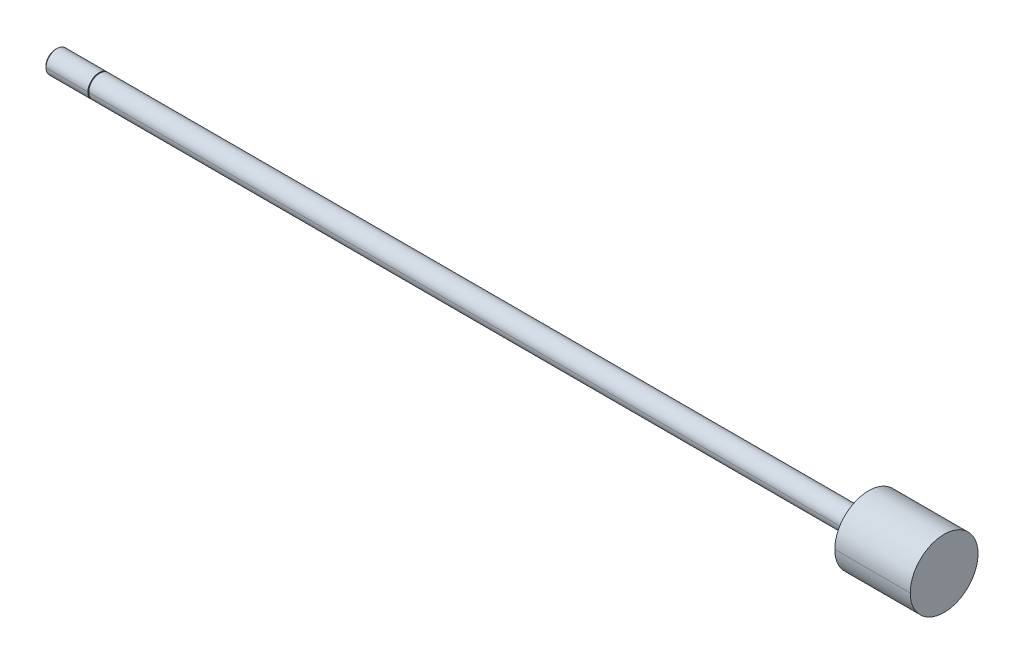
ISO-10303-21;
HEADER;
FILE_DESCRIPTION(('STEP AP214'),'2;1');
FILE_NAME('part.step','',(''),(''),'','','');
FILE_SCHEMA(('AUTOMOTIVE_DESIGN { 1 0 10303 214 1 1 1 1 }'));
ENDSEC;
DATA;
#1=APPLICATION_CONTEXT('core data for automotive mechanical design processes');
#2=APPLICATION_PROTOCOL_DEFINITION('international standard','automotive_design',2000,#1);
#3=PRODUCT_CONTEXT('',#1,'mechanical');
#4=PRODUCT('Part','Part','',(#3));
#5=PRODUCT_RELATED_PRODUCT_CATEGORY('part','',(#4));
#6=PRODUCT_DEFINITION_FORMATION('','',#4);
#7=PRODUCT_DEFINITION_CONTEXT('part definition',#1,'design');
#8=PRODUCT_DEFINITION('design','',#6,#7);
#9=PRODUCT_DEFINITION_SHAPE('','',#8);
#10=(LENGTH_UNIT() NAMED_UNIT(*) SI_UNIT(.MILLI.,.METRE.));
#11=(NAMED_UNIT(*) PLANE_ANGLE_UNIT() SI_UNIT($,.RADIAN.));
#12=(NAMED_UNIT(*) SI_UNIT($,.STERADIAN.) SOLID_ANGLE_UNIT());
#13=UNCERTAINTY_MEASURE_WITH_UNIT(LENGTH_MEASURE(1.E-05),#10,'distance_accuracy_value','');
#14=(GEOMETRIC_REPRESENTATION_CONTEXT(3) GLOBAL_UNCERTAINTY_ASSIGNED_CONTEXT((#13)) GLOBAL_UNIT_ASSIGNED_CONTEXT((#10,
#11,#12)) REPRESENTATION_CONTEXT('',''));
#15=CARTESIAN_POINT('',(0.,0.,0.));
#16=DIRECTION('',(0.,0.,1.));
#17=DIRECTION('',(1.,0.,0.));
#18=AXIS2_PLACEMENT_3D('',#15,#16,#17);
#19=CARTESIAN_POINT('',(0.,0.,0.));
#20=DIRECTION('',(-1.,0.,0.));
#21=DIRECTION('',(0.,-1.,0.));
#22=AXIS2_PLACEMENT_3D('',#19,#20,#21);
#23=CYLINDRICAL_SURFACE('',#22,2.921);
#24=CARTESIAN_POINT('',(0.,0.,0.));
#25=DIRECTION('',(1.,0.,0.));
#26=DIRECTION('',(0.,0.,-1.));
#27=AXIS2_PLACEMENT_3D('',#24,#25,#26);
#28=CIRCLE('',#27,2.921);
#29=CARTESIAN_POINT('',(0.,0.,-2.921));
#30=VERTEX_POINT('',#29);
#31=CARTESIAN_POINT('',(0.,0.,2.921));
#32=VERTEX_POINT('',#31);
#33=EDGE_CURVE('E11',#30,#32,#28,.T.);
#34=ORIENTED_EDGE('',*,*,#33,.F.);
#35=DIRECTION('',(-1.,0.,0.));
#36=VECTOR('',#35,1.);
#37=CARTESIAN_POINT('',(0.,0.,-2.921));
#38=LINE('',#37,#36);
#39=CARTESIAN_POINT('',(-0.254,0.,-2.921));
#40=VERTEX_POINT('',#39);
#41=EDGE_CURVE('E25',#30,#40,#38,.T.);
#42=ORIENTED_EDGE('',*,*,#41,.T.);
#43=CARTESIAN_POINT('',(-0.254,0.,0.));
#44=DIRECTION('',(1.,0.,0.));
#45=DIRECTION('',(0.,0.,-1.));
#46=AXIS2_PLACEMENT_3D('',#43,#44,#45);
#47=CIRCLE('',#46,2.921);
#48=CARTESIAN_POINT('',(-0.254,0.,2.921));
#49=VERTEX_POINT('',#48);
#50=EDGE_CURVE('E211',#40,#49,#47,.T.);
#51=ORIENTED_EDGE('',*,*,#50,.T.);
#52=DIRECTION('',(-1.,0.,0.));
#53=VECTOR('',#52,1.);
#54=CARTESIAN_POINT('',(0.,0.,2.921));
#55=LINE('',#54,#53);
#56=EDGE_CURVE('E206',#32,#49,#55,.T.);
#57=ORIENTED_EDGE('',*,*,#56,.F.);
#58=EDGE_LOOP('',(#34,#42,#51,#57));
#59=FACE_BOUND('',#58,.T.);
#60=ADVANCED_FACE('F17',(#59),#23,.T.);
#61=CARTESIAN_POINT('',(0.,0.,0.));
#62=DIRECTION('',(-1.,0.,0.));
#63=DIRECTION('',(0.,1.,0.));
#64=AXIS2_PLACEMENT_3D('',#61,#62,#63);
#65=CYLINDRICAL_SURFACE('',#64,2.921);
#66=CARTESIAN_POINT('',(-0.254,0.,0.));
#67=DIRECTION('',(1.,0.,0.));
#68=DIRECTION('',(0.,0.,-1.));
#69=AXIS2_PLACEMENT_3D('',#66,#67,#68);
#70=CIRCLE('',#69,2.921);
#71=EDGE_CURVE('E202',#49,#40,#70,.T.);
#72=ORIENTED_EDGE('',*,*,#71,.T.);
#73=ORIENTED_EDGE('',*,*,#41,.F.);
#74=CARTESIAN_POINT('',(0.,0.,0.));
#75=DIRECTION('',(1.,0.,0.));
#76=DIRECTION('',(0.,0.,-1.));
#77=AXIS2_PLACEMENT_3D('',#74,#75,#76);
#78=CIRCLE('',#77,2.921);
#79=EDGE_CURVE('E197',#32,#30,#78,.T.);
#80=ORIENTED_EDGE('',*,*,#79,.F.);
#81=ORIENTED_EDGE('',*,*,#56,.T.);
#82=EDGE_LOOP('',(#72,#73,#80,#81));
#83=FACE_BOUND('',#82,.T.);
#84=ADVANCED_FACE('F224',(#83),#65,.T.);
#85=CARTESIAN_POINT('',(0.,2.921,0.));
#86=DIRECTION('',(1.,0.,0.));
#87=DIRECTION('',(0.,0.,-1.));
#88=AXIS2_PLACEMENT_3D('',#85,#86,#87);
#89=PLANE('',#88);
#90=CARTESIAN_POINT('',(0.,0.,0.));
#91=DIRECTION('',(1.,0.,0.));
#92=DIRECTION('',(0.,0.,-1.));
#93=AXIS2_PLACEMENT_3D('',#90,#91,#92);
#94=CIRCLE('',#93,3.175);
#95=CARTESIAN_POINT('',(0.,0.,-3.175));
#96=VERTEX_POINT('',#95);
#97=CARTESIAN_POINT('',(0.,0.,3.175));
#98=VERTEX_POINT('',#97);
#99=EDGE_CURVE('E192',#96,#98,#94,.T.);
#100=ORIENTED_EDGE('',*,*,#99,.F.);
#101=CARTESIAN_POINT('',(0.,0.,0.));
#102=DIRECTION('',(1.,0.,0.));
#103=DIRECTION('',(0.,0.,-1.));
#104=AXIS2_PLACEMENT_3D('',#101,#102,#103);
#105=CIRCLE('',#104,3.175);
#106=EDGE_CURVE('E187',#98,#96,#105,.T.);
#107=ORIENTED_EDGE('',*,*,#106,.F.);
#108=EDGE_LOOP('',(#100,#107));
#109=FACE_BOUND('',#108,.T.);
#110=ORIENTED_EDGE('',*,*,#33,.T.);
#111=ORIENTED_EDGE('',*,*,#79,.T.);
#112=EDGE_LOOP('',(#110,#111));
#113=FACE_BOUND('',#112,.T.);
#114=ADVANCED_FACE('F249',(#109,#113),#89,.F.);
#115=CARTESIAN_POINT('',(239.7252,0.,0.));
#116=DIRECTION('',(-1.,0.,0.));
#117=DIRECTION('',(0.,1.,0.));
#118=AXIS2_PLACEMENT_3D('',#115,#116,#117);
#119=CYLINDRICAL_SURFACE('',#118,3.175);
#120=ORIENTED_EDGE('',*,*,#106,.T.);
#121=DIRECTION('',(-1.,0.,0.));
#122=VECTOR('',#121,1.);
#123=CARTESIAN_POINT('',(218.2876,0.,-3.175));
#124=LINE('',#123,#122);
#125=CARTESIAN_POINT('',(218.2876,0.,-3.175));
#126=VERTEX_POINT('',#125);
#127=EDGE_CURVE('E182',#126,#96,#124,.T.);
#128=ORIENTED_EDGE('',*,*,#127,.F.);
#129=CARTESIAN_POINT('',(218.2876,0.,0.));
#130=DIRECTION('',(1.,0.,0.));
#131=DIRECTION('',(0.,0.,-1.));
#132=AXIS2_PLACEMENT_3D('',#129,#130,#131);
#133=CIRCLE('',#132,3.175);
#134=CARTESIAN_POINT('',(218.2876,0.,3.175));
#135=VERTEX_POINT('',#134);
#136=EDGE_CURVE('E177',#135,#126,#133,.T.);
#137=ORIENTED_EDGE('',*,*,#136,.F.);
#138=DIRECTION('',(-1.,0.,0.));
#139=VECTOR('',#138,1.);
#140=CARTESIAN_POINT('',(218.2876,0.,3.175));
#141=LINE('',#140,#139);
#142=EDGE_CURVE('E172',#135,#98,#141,.T.);
#143=ORIENTED_EDGE('',*,*,#142,.T.);
#144=EDGE_LOOP('',(#120,#128,#137,#143));
#145=FACE_BOUND('',#144,.T.);
#146=ADVANCED_FACE('F253',(#145),#119,.T.);
#147=CARTESIAN_POINT('',(239.7252,0.,0.));
#148=DIRECTION('',(-1.,0.,0.));
#149=DIRECTION('',(0.,-1.,0.));
#150=AXIS2_PLACEMENT_3D('',#147,#148,#149);
#151=CYLINDRICAL_SURFACE('',#150,3.175);
#152=CARTESIAN_POINT('',(218.2876,0.,0.));
#153=DIRECTION('',(1.,0.,0.));
#154=DIRECTION('',(0.,0.,-1.));
#155=AXIS2_PLACEMENT_3D('',#152,#153,#154);
#156=CIRCLE('',#155,3.175);
#157=EDGE_CURVE('E167',#126,#135,#156,.T.);
#158=ORIENTED_EDGE('',*,*,#157,.F.);
#159=ORIENTED_EDGE('',*,*,#127,.T.);
#160=ORIENTED_EDGE('',*,*,#99,.T.);
#161=ORIENTED_EDGE('',*,*,#142,.F.);
#162=EDGE_LOOP('',(#158,#159,#160,#161));
#163=FACE_BOUND('',#162,.T.);
#164=ADVANCED_FACE('F259',(#163),#151,.T.);
#165=CARTESIAN_POINT('',(218.2876,3.175,0.));
#166=DIRECTION('',(1.,0.,0.));
#167=DIRECTION('',(0.,0.,-1.));
#168=AXIS2_PLACEMENT_3D('',#165,#166,#167);
#169=PLANE('',#168);
#170=CARTESIAN_POINT('',(218.2876,0.,0.));
#171=DIRECTION('',(1.,0.,0.));
#172=DIRECTION('',(0.,0.,-1.));
#173=AXIS2_PLACEMENT_3D('',#170,#171,#172);
#174=CIRCLE('',#173,9.62025);
#175=CARTESIAN_POINT('',(218.2876,0.,-9.62025));
#176=VERTEX_POINT('',#175);
#177=CARTESIAN_POINT('',(218.2876,0.,9.62025));
#178=VERTEX_POINT('',#177);
#179=EDGE_CURVE('E162',#176,#178,#174,.T.);
#180=ORIENTED_EDGE('',*,*,#179,.F.);
#181=CARTESIAN_POINT('',(218.2876,0.,0.));
#182=DIRECTION('',(1.,0.,0.));
#183=DIRECTION('',(0.,0.,-1.));
#184=AXIS2_PLACEMENT_3D('',#181,#182,#183);
#185=CIRCLE('',#184,9.62025);
#186=EDGE_CURVE('E157',#178,#176,#185,.T.);
#187=ORIENTED_EDGE('',*,*,#186,.F.);
#188=EDGE_LOOP('',(#180,#187));
#189=FACE_BOUND('',#188,.T.);
#190=ORIENTED_EDGE('',*,*,#157,.T.);
#191=ORIENTED_EDGE('',*,*,#136,.T.);
#192=EDGE_LOOP('',(#190,#191));
#193=FACE_BOUND('',#192,.T.);
#194=ADVANCED_FACE('F263',(#189,#193),#169,.F.);
#195=CARTESIAN_POINT('',(239.7252,0.,0.));
#196=DIRECTION('',(-1.,0.,0.));
#197=DIRECTION('',(0.,1.,0.));
#198=AXIS2_PLACEMENT_3D('',#195,#196,#197);
#199=CYLINDRICAL_SURFACE('',#198,9.62025);
#200=ORIENTED_EDGE('',*,*,#186,.T.);
#201=DIRECTION('',(-1.,0.,0.));
#202=VECTOR('',#201,1.);
#203=CARTESIAN_POINT('',(239.7252,0.,-9.62025));
#204=LINE('',#203,#202);
#205=CARTESIAN_POINT('',(239.7252,0.,-9.62025));
#206=VERTEX_POINT('',#205);
#207=EDGE_CURVE('E152',#206,#176,#204,.T.);
#208=ORIENTED_EDGE('',*,*,#207,.F.);
#209=CARTESIAN_POINT('',(239.7252,0.,0.));
#210=DIRECTION('',(1.,0.,0.));
#211=DIRECTION('',(0.,0.,-1.));
#212=AXIS2_PLACEMENT_3D('',#209,#210,#211);
#213=CIRCLE('',#212,9.62025);
#214=CARTESIAN_POINT('',(239.7252,0.,9.62025));
#215=VERTEX_POINT('',#214);
#216=EDGE_CURVE('E147',#215,#206,#213,.T.);
#217=ORIENTED_EDGE('',*,*,#216,.F.);
#218=DIRECTION('',(-1.,0.,0.));
#219=VECTOR('',#218,1.);
#220=CARTESIAN_POINT('',(239.7252,0.,9.62025));
#221=LINE('',#220,#219);
#222=EDGE_CURVE('E142',#215,#178,#221,.T.);
#223=ORIENTED_EDGE('',*,*,#222,.T.);
#224=EDGE_LOOP('',(#200,#208,#217,#223));
#225=FACE_BOUND('',#224,.T.);
#226=ADVANCED_FACE('F267',(#225),#199,.T.);
#227=CARTESIAN_POINT('',(239.7252,0.,0.));
#228=DIRECTION('',(-1.,0.,0.));
#229=DIRECTION('',(0.,-1.,0.));
#230=AXIS2_PLACEMENT_3D('',#227,#228,#229);
#231=CYLINDRICAL_SURFACE('',#230,9.62025);
#232=CARTESIAN_POINT('',(239.7252,0.,0.));
#233=DIRECTION('',(1.,0.,0.));
#234=DIRECTION('',(0.,0.,-1.));
#235=AXIS2_PLACEMENT_3D('',#232,#233,#234);
#236=CIRCLE('',#235,9.62025);
#237=EDGE_CURVE('E137',#206,#215,#236,.T.);
#238=ORIENTED_EDGE('',*,*,#237,.F.);
#239=ORIENTED_EDGE('',*,*,#207,.T.);
#240=ORIENTED_EDGE('',*,*,#179,.T.);
#241=ORIENTED_EDGE('',*,*,#222,.F.);
#242=EDGE_LOOP('',(#238,#239,#240,#241));
#243=FACE_BOUND('',#242,.T.);
#244=ADVANCED_FACE('F271',(#243),#231,.T.);
#245=CARTESIAN_POINT('',(239.7252,9.62025,0.));
#246=DIRECTION('',(-1.,0.,0.));
#247=DIRECTION('',(0.,0.,1.));
#248=AXIS2_PLACEMENT_3D('',#245,#246,#247);
#249=PLANE('',#248);
#250=ORIENTED_EDGE('',*,*,#237,.T.);
#251=ORIENTED_EDGE('',*,*,#216,.T.);
#252=EDGE_LOOP('',(#250,#251));
#253=FACE_BOUND('',#252,.T.);
#254=ADVANCED_FACE('F229',(#253),#249,.F.);
#255=CARTESIAN_POINT('',(-0.254,3.429,0.));
#256=DIRECTION('',(-1.,0.,0.));
#257=DIRECTION('',(0.,0.,1.));
#258=AXIS2_PLACEMENT_3D('',#255,#256,#257);
#259=PLANE('',#258);
#260=ORIENTED_EDGE('',*,*,#50,.F.);
#261=ORIENTED_EDGE('',*,*,#71,.F.);
#262=EDGE_LOOP('',(#260,#261));
#263=FACE_BOUND('',#262,.T.);
#264=CARTESIAN_POINT('',(-0.254000000000005,0.,0.));
#265=DIRECTION('',(-1.,0.,0.));
#266=DIRECTION('',(0.,0.,1.));
#267=AXIS2_PLACEMENT_3D('',#264,#265,#266);
#268=CIRCLE('',#267,3.175);
#269=CARTESIAN_POINT('',(-0.254000000000005,0.,3.175));
#270=VERTEX_POINT('',#269);
#271=CARTESIAN_POINT('',(-0.254000000000019,0.,-3.175));
#272=VERTEX_POINT('',#271);
#273=EDGE_CURVE('E132',#270,#272,#268,.T.);
#274=ORIENTED_EDGE('',*,*,#273,.F.);
#275=CARTESIAN_POINT('',(-0.254000000000005,0.,0.));
#276=DIRECTION('',(-1.,0.,0.));
#277=DIRECTION('',(0.,0.,1.));
#278=AXIS2_PLACEMENT_3D('',#275,#276,#277);
#279=CIRCLE('',#278,3.175);
#280=EDGE_CURVE('E127',#272,#270,#279,.T.);
#281=ORIENTED_EDGE('',*,*,#280,.F.);
#282=EDGE_LOOP('',(#274,#281));
#283=FACE_BOUND('',#282,.T.);
#284=ADVANCED_FACE('F225',(#263,#283),#259,.F.);
#285=CARTESIAN_POINT('',(239.7252,0.,0.));
#286=DIRECTION('',(-1.,0.,0.));
#287=DIRECTION('',(0.,1.,0.));
#288=AXIS2_PLACEMENT_3D('',#285,#286,#287);
#289=CYLINDRICAL_SURFACE('',#288,3.175);
#290=CARTESIAN_POINT('',(-12.15898,0.,0.));
#291=DIRECTION('',(1.,0.,0.));
#292=DIRECTION('',(0.,0.,-1.));
#293=AXIS2_PLACEMENT_3D('',#290,#291,#292);
#294=CIRCLE('',#293,3.175);
#295=CARTESIAN_POINT('',(-12.15898,0.,3.175));
#296=VERTEX_POINT('',#295);
#297=CARTESIAN_POINT('',(-12.15898,0.,-3.175));
#298=VERTEX_POINT('',#297);
#299=EDGE_CURVE('E98',#296,#298,#294,.T.);
#300=ORIENTED_EDGE('',*,*,#299,.T.);
#301=DIRECTION('',(-1.,0.,0.));
#302=VECTOR('',#301,1.);
#303=CARTESIAN_POINT('',(-0.254000000000019,0.,-3.175));
#304=LINE('',#303,#302);
#305=EDGE_CURVE('E119',#272,#298,#304,.T.);
#306=ORIENTED_EDGE('',*,*,#305,.F.);
#307=ORIENTED_EDGE('',*,*,#280,.T.);
#308=DIRECTION('',(-1.,0.,0.));
#309=VECTOR('',#308,1.);
#310=CARTESIAN_POINT('',(-0.254000000000019,0.,3.175));
#311=LINE('',#310,#309);
#312=EDGE_CURVE('E115',#270,#296,#311,.T.);
#313=ORIENTED_EDGE('',*,*,#312,.T.);
#314=EDGE_LOOP('',(#300,#306,#307,#313));
#315=FACE_BOUND('',#314,.T.);
#316=ADVANCED_FACE('F228',(#315),#289,.T.);
#317=CARTESIAN_POINT('',(239.7252,0.,0.));
#318=DIRECTION('',(-1.,0.,0.));
#319=DIRECTION('',(0.,-1.,0.));
#320=AXIS2_PLACEMENT_3D('',#317,#318,#319);
#321=CYLINDRICAL_SURFACE('',#320,3.175);
#322=ORIENTED_EDGE('',*,*,#273,.T.);
#323=ORIENTED_EDGE('',*,*,#305,.T.);
#324=CARTESIAN_POINT('',(-12.15898,0.,0.));
#325=DIRECTION('',(1.,0.,0.));
#326=DIRECTION('',(0.,0.,-1.));
#327=AXIS2_PLACEMENT_3D('',#324,#325,#326);
#328=CIRCLE('',#327,3.175);
#329=EDGE_CURVE('E110',#298,#296,#328,.T.);
#330=ORIENTED_EDGE('',*,*,#329,.T.);
#331=ORIENTED_EDGE('',*,*,#312,.F.);
#332=EDGE_LOOP('',(#322,#323,#330,#331));
#333=FACE_BOUND('',#332,.T.);
#334=ADVANCED_FACE('F235',(#333),#321,.T.);
#335=CARTESIAN_POINT('',(-12.7,0.,0.));
#336=DIRECTION('',(1.,0.,0.));
#337=DIRECTION('',(0.,-1.,0.));
#338=AXIS2_PLACEMENT_3D('',#335,#336,#337);
#339=CONICAL_SURFACE('',#338,2.63398,0.7853981634);
#340=ORIENTED_EDGE('',*,*,#329,.F.);
#341=DIRECTION('',(0.707106781184742,0.,-0.707106781188353));
#342=VECTOR('',#341,1.);
#343=CARTESIAN_POINT('',(-12.7,0.,-2.63398));
#344=LINE('',#343,#342);
#345=CARTESIAN_POINT('',(-12.7,0.,-2.63398));
#346=VERTEX_POINT('',#345);
#347=EDGE_CURVE('E90',#346,#298,#344,.T.);
#348=ORIENTED_EDGE('',*,*,#347,.F.);
#349=CARTESIAN_POINT('',(-12.7,0.,0.));
#350=DIRECTION('',(1.,0.,0.));
#351=DIRECTION('',(0.,0.,-1.));
#352=AXIS2_PLACEMENT_3D('',#349,#350,#351);
#353=CIRCLE('',#352,2.63398);
#354=CARTESIAN_POINT('',(-12.7,0.,2.63398));
#355=VERTEX_POINT('',#354);
#356=EDGE_CURVE('E83',#346,#355,#353,.T.);
#357=ORIENTED_EDGE('',*,*,#356,.T.);
#358=DIRECTION('',(0.707106781184742,0.,0.707106781188353));
#359=VECTOR('',#358,1.);
#360=CARTESIAN_POINT('',(-12.7,0.,2.63398));
#361=LINE('',#360,#359);
#362=EDGE_CURVE('E87',#355,#296,#361,.T.);
#363=ORIENTED_EDGE('',*,*,#362,.T.);
#364=EDGE_LOOP('',(#340,#348,#357,#363));
#365=FACE_BOUND('',#364,.T.);
#366=ADVANCED_FACE('F86',(#365),#339,.T.);
#367=CARTESIAN_POINT('',(-12.7,0.,0.));
#368=DIRECTION('',(1.,0.,0.));
#369=DIRECTION('',(0.,1.,0.));
#370=AXIS2_PLACEMENT_3D('',#367,#368,#369);
#371=CONICAL_SURFACE('',#370,2.63398,0.7853981634);
#372=CARTESIAN_POINT('',(-12.7,0.,0.));
#373=DIRECTION('',(1.,0.,0.));
#374=DIRECTION('',(0.,0.,-1.));
#375=AXIS2_PLACEMENT_3D('',#372,#373,#374);
#376=CIRCLE('',#375,2.63398);
#377=EDGE_CURVE('E97',#355,#346,#376,.T.);
#378=ORIENTED_EDGE('',*,*,#377,.T.);
#379=ORIENTED_EDGE('',*,*,#347,.T.);
#380=ORIENTED_EDGE('',*,*,#299,.F.);
#381=ORIENTED_EDGE('',*,*,#362,.F.);
#382=EDGE_LOOP('',(#378,#379,#380,#381));
#383=FACE_BOUND('',#382,.T.);
#384=ADVANCED_FACE('F96',(#383),#371,.T.);
#385=CARTESIAN_POINT('',(-12.7,0.,0.));
#386=DIRECTION('',(1.,0.,0.));
#387=DIRECTION('',(0.,0.,-1.));
#388=AXIS2_PLACEMENT_3D('',#385,#386,#387);
#389=PLANE('',#388);
#390=ORIENTED_EDGE('',*,*,#356,.F.);
#391=ORIENTED_EDGE('',*,*,#377,.F.);
#392=EDGE_LOOP('',(#390,#391));
#393=FACE_BOUND('',#392,.T.);
#394=ADVANCED_FACE('F100',(#393),#389,.F.);
#395=CLOSED_SHELL('',(#60,#84,#114,#146,#164,#194,#226,#244,#254,#284,#316,#334,#366,#384,#394));
#396=MANIFOLD_SOLID_BREP('B1',#395);
#397=ADVANCED_BREP_SHAPE_REPRESENTATION('',(#18,#396),#14);
#398=SHAPE_DEFINITION_REPRESENTATION(#9,#397);
ENDSEC;
END-ISO-10303-21;
